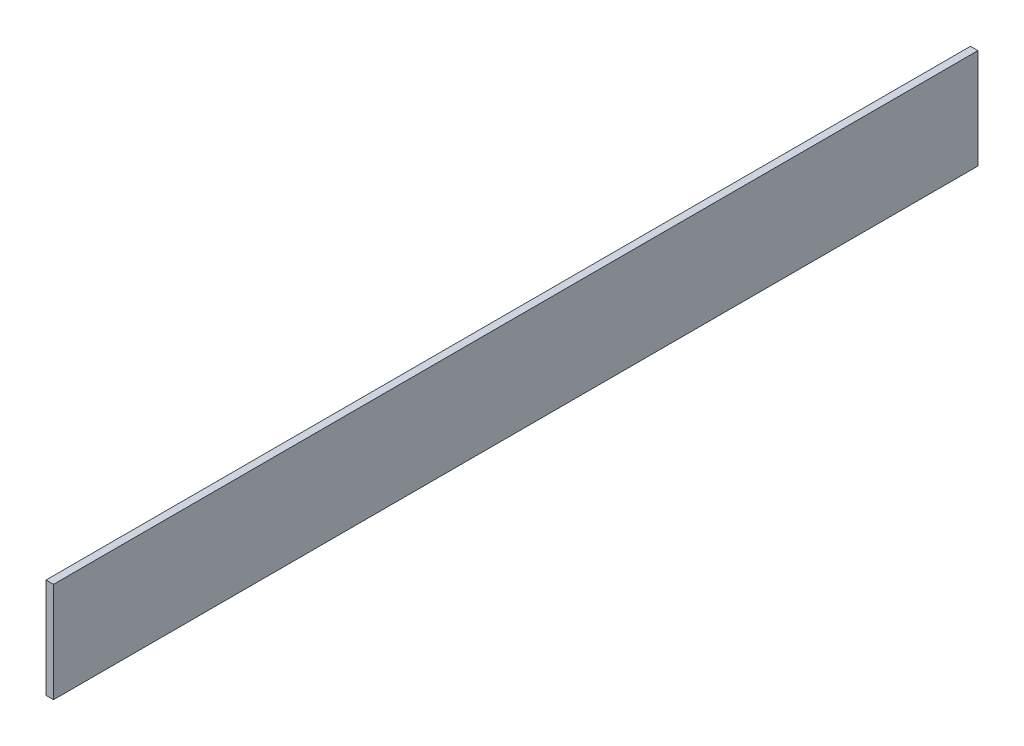
ISO-10303-21;
HEADER;
FILE_DESCRIPTION(('STEP AP214'),'2;1');
FILE_NAME('part.step','',(''),(''),'','','');
FILE_SCHEMA(('AUTOMOTIVE_DESIGN { 1 0 10303 214 1 1 1 1 }'));
ENDSEC;
DATA;
#1=APPLICATION_CONTEXT('core data for automotive mechanical design processes');
#2=APPLICATION_PROTOCOL_DEFINITION('international standard','automotive_design',2000,#1);
#3=PRODUCT_CONTEXT('',#1,'mechanical');
#4=PRODUCT('Part','Part','',(#3));
#5=PRODUCT_RELATED_PRODUCT_CATEGORY('part','',(#4));
#6=PRODUCT_DEFINITION_FORMATION('','',#4);
#7=PRODUCT_DEFINITION_CONTEXT('part definition',#1,'design');
#8=PRODUCT_DEFINITION('design','',#6,#7);
#9=PRODUCT_DEFINITION_SHAPE('','',#8);
#10=(LENGTH_UNIT() NAMED_UNIT(*) SI_UNIT(.MILLI.,.METRE.));
#11=(NAMED_UNIT(*) PLANE_ANGLE_UNIT() SI_UNIT($,.RADIAN.));
#12=(NAMED_UNIT(*) SI_UNIT($,.STERADIAN.) SOLID_ANGLE_UNIT());
#13=UNCERTAINTY_MEASURE_WITH_UNIT(LENGTH_MEASURE(1.E-05),#10,'distance_accuracy_value','');
#14=(GEOMETRIC_REPRESENTATION_CONTEXT(3) GLOBAL_UNCERTAINTY_ASSIGNED_CONTEXT((#13)) GLOBAL_UNIT_ASSIGNED_CONTEXT((#10,
#11,#12)) REPRESENTATION_CONTEXT('',''));
#15=CARTESIAN_POINT('',(0.,0.,0.));
#16=DIRECTION('',(0.,0.,1.));
#17=DIRECTION('',(1.,0.,0.));
#18=AXIS2_PLACEMENT_3D('',#15,#16,#17);
#19=CARTESIAN_POINT('',(4.7625,0.,0.));
#20=DIRECTION('',(0.,0.,-1.));
#21=DIRECTION('',(-1.,0.,0.));
#22=AXIS2_PLACEMENT_3D('',#19,#20,#21);
#23=PLANE('',#22);
#24=DIRECTION('',(0.,-1.,0.));
#25=VECTOR('',#24,1.);
#26=CARTESIAN_POINT('',(0.,0.,0.));
#27=LINE('',#26,#25);
#28=CARTESIAN_POINT('',(0.,63.5,0.));
#29=VERTEX_POINT('',#28);
#30=CARTESIAN_POINT('',(0.,0.,0.));
#31=VERTEX_POINT('',#30);
#32=EDGE_CURVE('E107',#29,#31,#27,.T.);
#33=ORIENTED_EDGE('',*,*,#32,.T.);
#34=DIRECTION('',(-1.,0.,0.));
#35=VECTOR('',#34,1.);
#36=CARTESIAN_POINT('',(4.7625,0.,0.));
#37=LINE('',#36,#35);
#38=CARTESIAN_POINT('',(4.7625,0.,0.));
#39=VERTEX_POINT('',#38);
#40=EDGE_CURVE('E11',#39,#31,#37,.T.);
#41=ORIENTED_EDGE('',*,*,#40,.F.);
#42=DIRECTION('',(0.,-1.,0.));
#43=VECTOR('',#42,1.);
#44=CARTESIAN_POINT('',(4.7625,0.,0.));
#45=LINE('',#44,#43);
#46=CARTESIAN_POINT('',(4.7625,63.5,0.));
#47=VERTEX_POINT('',#46);
#48=EDGE_CURVE('E91',#47,#39,#45,.T.);
#49=ORIENTED_EDGE('',*,*,#48,.F.);
#50=DIRECTION('',(-1.,0.,0.));
#51=VECTOR('',#50,1.);
#52=CARTESIAN_POINT('',(4.7625,63.5,0.));
#53=LINE('',#52,#51);
#54=EDGE_CURVE('E103',#47,#29,#53,.T.);
#55=ORIENTED_EDGE('',*,*,#54,.T.);
#56=EDGE_LOOP('',(#33,#41,#49,#55));
#57=FACE_BOUND('',#56,.T.);
#58=ADVANCED_FACE('F39',(#57),#23,.F.);
#59=CARTESIAN_POINT('',(4.7625,0.,0.));
#60=DIRECTION('',(0.,1.,0.));
#61=DIRECTION('',(0.,0.,1.));
#62=AXIS2_PLACEMENT_3D('',#59,#60,#61);
#63=PLANE('',#62);
#64=DIRECTION('',(0.,0.,-1.));
#65=VECTOR('',#64,1.);
#66=CARTESIAN_POINT('',(0.,0.,0.));
#67=LINE('',#66,#65);
#68=CARTESIAN_POINT('',(0.,0.,-587.375));
#69=VERTEX_POINT('',#68);
#70=EDGE_CURVE('E96',#31,#69,#67,.T.);
#71=ORIENTED_EDGE('',*,*,#70,.T.);
#72=DIRECTION('',(-1.,0.,0.));
#73=VECTOR('',#72,1.);
#74=CARTESIAN_POINT('',(4.7625,0.,-587.375));
#75=LINE('',#74,#73);
#76=CARTESIAN_POINT('',(4.7625,0.,-587.375));
#77=VERTEX_POINT('',#76);
#78=EDGE_CURVE('E48',#77,#69,#75,.T.);
#79=ORIENTED_EDGE('',*,*,#78,.F.);
#80=DIRECTION('',(0.,0.,-1.));
#81=VECTOR('',#80,1.);
#82=CARTESIAN_POINT('',(4.7625,0.,0.));
#83=LINE('',#82,#81);
#84=EDGE_CURVE('E86',#39,#77,#83,.T.);
#85=ORIENTED_EDGE('',*,*,#84,.F.);
#86=ORIENTED_EDGE('',*,*,#40,.T.);
#87=EDGE_LOOP('',(#71,#79,#85,#86));
#88=FACE_BOUND('',#87,.T.);
#89=ADVANCED_FACE('F95',(#88),#63,.F.);
#90=CARTESIAN_POINT('',(4.7625,0.,-587.375));
#91=DIRECTION('',(0.,0.,1.));
#92=DIRECTION('',(1.,0.,0.));
#93=AXIS2_PLACEMENT_3D('',#90,#91,#92);
#94=PLANE('',#93);
#95=DIRECTION('',(0.,1.,0.));
#96=VECTOR('',#95,1.);
#97=CARTESIAN_POINT('',(0.,0.,-587.375));
#98=LINE('',#97,#96);
#99=CARTESIAN_POINT('',(0.,63.5,-587.375));
#100=VERTEX_POINT('',#99);
#101=EDGE_CURVE('E73',#69,#100,#98,.T.);
#102=ORIENTED_EDGE('',*,*,#101,.T.);
#103=DIRECTION('',(-1.,0.,0.));
#104=VECTOR('',#103,1.);
#105=CARTESIAN_POINT('',(4.7625,63.5,-587.375));
#106=LINE('',#105,#104);
#107=CARTESIAN_POINT('',(4.7625,63.5,-587.375));
#108=VERTEX_POINT('',#107);
#109=EDGE_CURVE('E98',#108,#100,#106,.T.);
#110=ORIENTED_EDGE('',*,*,#109,.F.);
#111=DIRECTION('',(0.,1.,0.));
#112=VECTOR('',#111,1.);
#113=CARTESIAN_POINT('',(4.7625,0.,-587.375));
#114=LINE('',#113,#112);
#115=EDGE_CURVE('E89',#77,#108,#114,.T.);
#116=ORIENTED_EDGE('',*,*,#115,.F.);
#117=ORIENTED_EDGE('',*,*,#78,.T.);
#118=EDGE_LOOP('',(#102,#110,#116,#117));
#119=FACE_BOUND('',#118,.T.);
#120=ADVANCED_FACE('F99',(#119),#94,.F.);
#121=CARTESIAN_POINT('',(4.7625,63.5,0.));
#122=DIRECTION('',(0.,-1.,0.));
#123=DIRECTION('',(0.,0.,-1.));
#124=AXIS2_PLACEMENT_3D('',#121,#122,#123);
#125=PLANE('',#124);
#126=DIRECTION('',(0.,0.,1.));
#127=VECTOR('',#126,1.);
#128=CARTESIAN_POINT('',(0.,63.5,0.));
#129=LINE('',#128,#127);
#130=EDGE_CURVE('E79',#100,#29,#129,.T.);
#131=ORIENTED_EDGE('',*,*,#130,.T.);
#132=ORIENTED_EDGE('',*,*,#54,.F.);
#133=DIRECTION('',(0.,0.,1.));
#134=VECTOR('',#133,1.);
#135=CARTESIAN_POINT('',(4.7625,63.5,0.));
#136=LINE('',#135,#134);
#137=EDGE_CURVE('E56',#108,#47,#136,.T.);
#138=ORIENTED_EDGE('',*,*,#137,.F.);
#139=ORIENTED_EDGE('',*,*,#109,.T.);
#140=EDGE_LOOP('',(#131,#132,#138,#139));
#141=FACE_BOUND('',#140,.T.);
#142=ADVANCED_FACE('F120',(#141),#125,.F.);
#143=CARTESIAN_POINT('',(4.7625,0.,0.));
#144=DIRECTION('',(-1.,0.,0.));
#145=DIRECTION('',(0.,0.,1.));
#146=AXIS2_PLACEMENT_3D('',#143,#144,#145);
#147=PLANE('',#146);
#148=ORIENTED_EDGE('',*,*,#48,.T.);
#149=ORIENTED_EDGE('',*,*,#84,.T.);
#150=ORIENTED_EDGE('',*,*,#115,.T.);
#151=ORIENTED_EDGE('',*,*,#137,.T.);
#152=EDGE_LOOP('',(#148,#149,#150,#151));
#153=FACE_BOUND('',#152,.T.);
#154=ADVANCED_FACE('F87',(#153),#147,.F.);
#155=CARTESIAN_POINT('',(0.,0.,0.));
#156=DIRECTION('',(-1.,0.,0.));
#157=DIRECTION('',(0.,0.,1.));
#158=AXIS2_PLACEMENT_3D('',#155,#156,#157);
#159=PLANE('',#158);
#160=ORIENTED_EDGE('',*,*,#32,.F.);
#161=ORIENTED_EDGE('',*,*,#130,.F.);
#162=ORIENTED_EDGE('',*,*,#101,.F.);
#163=ORIENTED_EDGE('',*,*,#70,.F.);
#164=EDGE_LOOP('',(#160,#161,#162,#163));
#165=FACE_BOUND('',#164,.T.);
#166=ADVANCED_FACE('F123',(#165),#159,.T.);
#167=CLOSED_SHELL('',(#58,#89,#120,#142,#154,#166));
#168=MANIFOLD_SOLID_BREP('B2',#167);
#169=ADVANCED_BREP_SHAPE_REPRESENTATION('',(#18,#168),#14);
#170=SHAPE_DEFINITION_REPRESENTATION(#9,#169);
ENDSEC;
END-ISO-10303-21;
